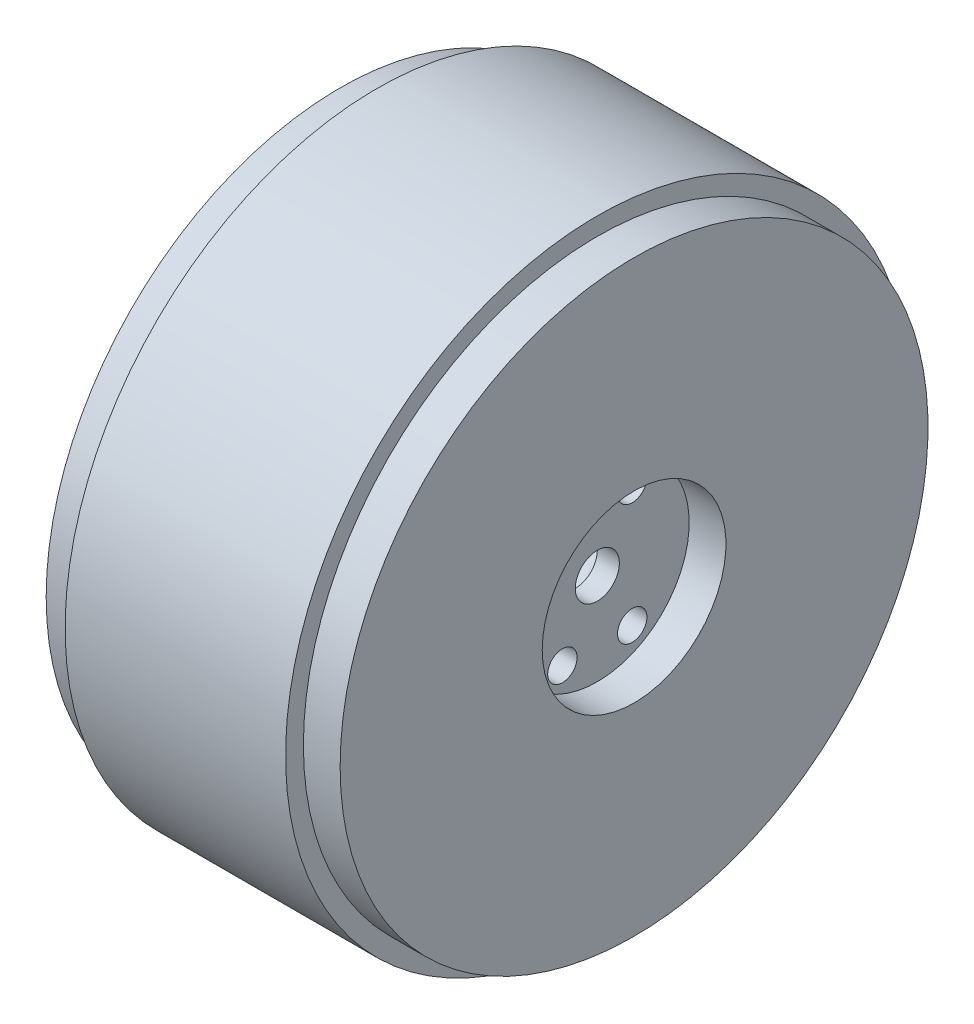
ISO-10303-21;
HEADER;
FILE_DESCRIPTION(('STEP AP214'),'2;1');
FILE_NAME('part.step','',(''),(''),'','','');
FILE_SCHEMA(('AUTOMOTIVE_DESIGN { 1 0 10303 214 1 1 1 1 }'));
ENDSEC;
DATA;
#1=APPLICATION_CONTEXT('core data for automotive mechanical design processes');
#2=APPLICATION_PROTOCOL_DEFINITION('international standard','automotive_design',2000,#1);
#3=PRODUCT_CONTEXT('',#1,'mechanical');
#4=PRODUCT('Part','Part','',(#3));
#5=PRODUCT_RELATED_PRODUCT_CATEGORY('part','',(#4));
#6=PRODUCT_DEFINITION_FORMATION('','',#4);
#7=PRODUCT_DEFINITION_CONTEXT('part definition',#1,'design');
#8=PRODUCT_DEFINITION('design','',#6,#7);
#9=PRODUCT_DEFINITION_SHAPE('','',#8);
#10=(LENGTH_UNIT() NAMED_UNIT(*) SI_UNIT(.MILLI.,.METRE.));
#11=(NAMED_UNIT(*) PLANE_ANGLE_UNIT() SI_UNIT($,.RADIAN.));
#12=(NAMED_UNIT(*) SI_UNIT($,.STERADIAN.) SOLID_ANGLE_UNIT());
#13=UNCERTAINTY_MEASURE_WITH_UNIT(LENGTH_MEASURE(1.E-05),#10,'distance_accuracy_value','');
#14=(GEOMETRIC_REPRESENTATION_CONTEXT(3) GLOBAL_UNCERTAINTY_ASSIGNED_CONTEXT((#13)) GLOBAL_UNIT_ASSIGNED_CONTEXT((#10,
#11,#12)) REPRESENTATION_CONTEXT('',''));
#15=CARTESIAN_POINT('',(0.,0.,0.));
#16=DIRECTION('',(0.,0.,1.));
#17=DIRECTION('',(1.,0.,0.));
#18=AXIS2_PLACEMENT_3D('',#15,#16,#17);
#19=CARTESIAN_POINT('',(-49.6444990272902,0.,0.));
#20=DIRECTION('',(-1.,0.,0.));
#21=DIRECTION('',(0.,0.,1.));
#22=AXIS2_PLACEMENT_3D('',#19,#20,#21);
#23=CYLINDRICAL_SURFACE('',#22,34.);
#24=CARTESIAN_POINT('',(0.,0.,0.));
#25=DIRECTION('',(-1.,0.,0.));
#26=DIRECTION('',(0.,0.,1.));
#27=AXIS2_PLACEMENT_3D('',#24,#25,#26);
#28=CIRCLE('',#27,34.);
#29=CARTESIAN_POINT('',(0.,0.,34.));
#30=VERTEX_POINT('',#29);
#31=EDGE_CURVE('E52',#30,#30,#28,.T.);
#32=ORIENTED_EDGE('',*,*,#31,.F.);
#33=EDGE_LOOP('',(#32));
#34=FACE_BOUND('',#33,.T.);
#35=CARTESIAN_POINT('',(-32.,0.,0.));
#36=DIRECTION('',(-1.,0.,0.));
#37=DIRECTION('',(0.,0.,1.));
#38=AXIS2_PLACEMENT_3D('',#35,#36,#37);
#39=CIRCLE('',#38,34.);
#40=CARTESIAN_POINT('',(-32.,0.,34.));
#41=VERTEX_POINT('',#40);
#42=EDGE_CURVE('E10',#41,#41,#39,.T.);
#43=ORIENTED_EDGE('',*,*,#42,.T.);
#44=EDGE_LOOP('',(#43));
#45=FACE_BOUND('',#44,.T.);
#46=ADVANCED_FACE('F33',(#34,#45),#23,.F.);
#47=CARTESIAN_POINT('',(-32.,34.,0.));
#48=DIRECTION('',(1.,0.,0.));
#49=DIRECTION('',(0.,0.,-1.));
#50=AXIS2_PLACEMENT_3D('',#47,#48,#49);
#51=PLANE('',#50);
#52=ORIENTED_EDGE('',*,*,#42,.F.);
#53=EDGE_LOOP('',(#52));
#54=FACE_BOUND('',#53,.T.);
#55=CARTESIAN_POINT('',(-32.,0.,0.));
#56=DIRECTION('',(-1.,0.,0.));
#57=DIRECTION('',(0.,0.,1.));
#58=AXIS2_PLACEMENT_3D('',#55,#56,#57);
#59=CIRCLE('',#58,40.);
#60=CARTESIAN_POINT('',(-32.,0.,40.));
#61=VERTEX_POINT('',#60);
#62=EDGE_CURVE('E39',#61,#61,#59,.T.);
#63=ORIENTED_EDGE('',*,*,#62,.T.);
#64=EDGE_LOOP('',(#63));
#65=FACE_BOUND('',#64,.T.);
#66=ADVANCED_FACE('F115',(#54,#65),#51,.F.);
#67=CARTESIAN_POINT('',(-49.6444990272902,0.,0.));
#68=DIRECTION('',(-1.,0.,0.));
#69=DIRECTION('',(0.,0.,1.));
#70=AXIS2_PLACEMENT_3D('',#67,#68,#69);
#71=CYLINDRICAL_SURFACE('',#70,40.);
#72=ORIENTED_EDGE('',*,*,#62,.F.);
#73=EDGE_LOOP('',(#72));
#74=FACE_BOUND('',#73,.T.);
#75=CARTESIAN_POINT('',(-27.,0.,0.));
#76=DIRECTION('',(-1.,0.,0.));
#77=DIRECTION('',(0.,0.,1.));
#78=AXIS2_PLACEMENT_3D('',#75,#76,#77);
#79=CIRCLE('',#78,40.);
#80=CARTESIAN_POINT('',(-27.,0.,40.));
#81=VERTEX_POINT('',#80);
#82=EDGE_CURVE('E91',#81,#81,#79,.T.);
#83=ORIENTED_EDGE('',*,*,#82,.T.);
#84=EDGE_LOOP('',(#83));
#85=FACE_BOUND('',#84,.T.);
#86=ADVANCED_FACE('F120',(#74,#85),#71,.T.);
#87=CARTESIAN_POINT('',(-49.6444990272902,0.,0.));
#88=DIRECTION('',(-1.,0.,0.));
#89=DIRECTION('',(0.,0.,1.));
#90=AXIS2_PLACEMENT_3D('',#87,#88,#89);
#91=CYLINDRICAL_SURFACE('',#90,40.);
#92=CARTESIAN_POINT('',(3.,0.,0.));
#93=DIRECTION('',(-1.,0.,0.));
#94=DIRECTION('',(0.,0.,1.));
#95=AXIS2_PLACEMENT_3D('',#92,#93,#94);
#96=CIRCLE('',#95,40.);
#97=CARTESIAN_POINT('',(3.,0.,40.));
#98=VERTEX_POINT('',#97);
#99=EDGE_CURVE('E43',#98,#98,#96,.T.);
#100=ORIENTED_EDGE('',*,*,#99,.F.);
#101=EDGE_LOOP('',(#100));
#102=FACE_BOUND('',#101,.T.);
#103=CARTESIAN_POINT('',(8.,0.,0.));
#104=DIRECTION('',(-1.,0.,0.));
#105=DIRECTION('',(0.,0.,1.));
#106=AXIS2_PLACEMENT_3D('',#103,#104,#105);
#107=CIRCLE('',#106,40.);
#108=CARTESIAN_POINT('',(8.,0.,40.));
#109=VERTEX_POINT('',#108);
#110=EDGE_CURVE('E47',#109,#109,#107,.T.);
#111=ORIENTED_EDGE('',*,*,#110,.T.);
#112=EDGE_LOOP('',(#111));
#113=FACE_BOUND('',#112,.T.);
#114=ADVANCED_FACE('F137',(#102,#113),#91,.T.);
#115=CARTESIAN_POINT('',(8.,40.,0.));
#116=DIRECTION('',(-1.,0.,0.));
#117=DIRECTION('',(0.,0.,1.));
#118=AXIS2_PLACEMENT_3D('',#115,#116,#117);
#119=PLANE('',#118);
#120=CARTESIAN_POINT('',(8.,0.,0.));
#121=DIRECTION('',(-1.,0.,0.));
#122=DIRECTION('',(0.,0.,1.));
#123=AXIS2_PLACEMENT_3D('',#120,#121,#122);
#124=CIRCLE('',#123,12.5);
#125=CARTESIAN_POINT('',(8.,0.,12.5));
#126=VERTEX_POINT('',#125);
#127=EDGE_CURVE('E55',#126,#126,#124,.T.);
#128=ORIENTED_EDGE('',*,*,#127,.T.);
#129=EDGE_LOOP('',(#128));
#130=FACE_BOUND('',#129,.T.);
#131=ORIENTED_EDGE('',*,*,#110,.F.);
#132=EDGE_LOOP('',(#131));
#133=FACE_BOUND('',#132,.T.);
#134=ADVANCED_FACE('F127',(#130,#133),#119,.F.);
#135=CARTESIAN_POINT('',(0.,34.,0.));
#136=DIRECTION('',(1.,0.,0.));
#137=DIRECTION('',(0.,0.,-1.));
#138=AXIS2_PLACEMENT_3D('',#135,#136,#137);
#139=PLANE('',#138);
#140=CARTESIAN_POINT('',(0.,0.,0.));
#141=DIRECTION('',(1.,0.,0.));
#142=DIRECTION('',(0.,0.,-1.));
#143=AXIS2_PLACEMENT_3D('',#140,#141,#142);
#144=CIRCLE('',#143,3.);
#145=CARTESIAN_POINT('',(0.,0.,-3.));
#146=VERTEX_POINT('',#145);
#147=EDGE_CURVE('E85',#146,#146,#144,.T.);
#148=ORIENTED_EDGE('',*,*,#147,.T.);
#149=EDGE_LOOP('',(#148));
#150=FACE_BOUND('',#149,.T.);
#151=CARTESIAN_POINT('',(0.,8.22724133595216,4.75000000000001));
#152=DIRECTION('',(1.,0.,0.));
#153=DIRECTION('',(0.,0.,-1.));
#154=AXIS2_PLACEMENT_3D('',#151,#152,#153);
#155=CIRCLE('',#154,2.);
#156=CARTESIAN_POINT('',(0.,8.22724133595216,2.75000000000001));
#157=VERTEX_POINT('',#156);
#158=EDGE_CURVE('E61',#157,#157,#155,.T.);
#159=ORIENTED_EDGE('',*,*,#158,.T.);
#160=EDGE_LOOP('',(#159));
#161=FACE_BOUND('',#160,.T.);
#162=CARTESIAN_POINT('',(0.,-8.22724133595216,-4.75000000000001));
#163=DIRECTION('',(1.,0.,0.));
#164=DIRECTION('',(0.,0.,-1.));
#165=AXIS2_PLACEMENT_3D('',#162,#163,#164);
#166=CIRCLE('',#165,2.);
#167=CARTESIAN_POINT('',(0.,-8.22724133595216,-6.75000000000001));
#168=VERTEX_POINT('',#167);
#169=EDGE_CURVE('E64',#168,#168,#166,.T.);
#170=ORIENTED_EDGE('',*,*,#169,.T.);
#171=EDGE_LOOP('',(#170));
#172=FACE_BOUND('',#171,.T.);
#173=CARTESIAN_POINT('',(0.,-8.22724133595216,4.75000000000001));
#174=DIRECTION('',(1.,0.,0.));
#175=DIRECTION('',(0.,0.,-1.));
#176=AXIS2_PLACEMENT_3D('',#173,#174,#175);
#177=CIRCLE('',#176,2.);
#178=CARTESIAN_POINT('',(0.,-8.22724133595216,2.75000000000001));
#179=VERTEX_POINT('',#178);
#180=EDGE_CURVE('E67',#179,#179,#177,.T.);
#181=ORIENTED_EDGE('',*,*,#180,.T.);
#182=EDGE_LOOP('',(#181));
#183=FACE_BOUND('',#182,.T.);
#184=CARTESIAN_POINT('',(0.,8.22724133595216,-4.75000000000001));
#185=DIRECTION('',(1.,0.,0.));
#186=DIRECTION('',(0.,0.,-1.));
#187=AXIS2_PLACEMENT_3D('',#184,#185,#186);
#188=CIRCLE('',#187,2.);
#189=CARTESIAN_POINT('',(0.,8.22724133595216,-6.75000000000001));
#190=VERTEX_POINT('',#189);
#191=EDGE_CURVE('E70',#190,#190,#188,.T.);
#192=ORIENTED_EDGE('',*,*,#191,.T.);
#193=EDGE_LOOP('',(#192));
#194=FACE_BOUND('',#193,.T.);
#195=ORIENTED_EDGE('',*,*,#31,.T.);
#196=EDGE_LOOP('',(#195));
#197=FACE_BOUND('',#196,.T.);
#198=ADVANCED_FACE('F124',(#150,#161,#172,#183,#194,#197),#139,.F.);
#199=CARTESIAN_POINT('',(0.,0.,0.));
#200=DIRECTION('',(-1.,0.,0.));
#201=DIRECTION('',(0.,0.,1.));
#202=AXIS2_PLACEMENT_3D('',#199,#200,#201);
#203=CYLINDRICAL_SURFACE('',#202,12.5);
#204=CARTESIAN_POINT('',(3.,0.,0.));
#205=DIRECTION('',(-1.,0.,0.));
#206=DIRECTION('',(0.,0.,1.));
#207=AXIS2_PLACEMENT_3D('',#204,#205,#206);
#208=CIRCLE('',#207,12.5);
#209=CARTESIAN_POINT('',(3.,0.,12.5));
#210=VERTEX_POINT('',#209);
#211=EDGE_CURVE('E58',#210,#210,#208,.T.);
#212=ORIENTED_EDGE('',*,*,#211,.T.);
#213=EDGE_LOOP('',(#212));
#214=FACE_BOUND('',#213,.T.);
#215=ORIENTED_EDGE('',*,*,#127,.F.);
#216=EDGE_LOOP('',(#215));
#217=FACE_BOUND('',#216,.T.);
#218=ADVANCED_FACE('F126',(#214,#217),#203,.F.);
#219=CARTESIAN_POINT('',(3.,12.5,0.));
#220=DIRECTION('',(1.,0.,0.));
#221=DIRECTION('',(0.,0.,-1.));
#222=AXIS2_PLACEMENT_3D('',#219,#220,#221);
#223=PLANE('',#222);
#224=CARTESIAN_POINT('',(3.,0.,0.));
#225=DIRECTION('',(1.,0.,0.));
#226=DIRECTION('',(0.,0.,-1.));
#227=AXIS2_PLACEMENT_3D('',#224,#225,#226);
#228=CIRCLE('',#227,3.);
#229=CARTESIAN_POINT('',(3.,0.,-3.));
#230=VERTEX_POINT('',#229);
#231=EDGE_CURVE('E88',#230,#230,#228,.T.);
#232=ORIENTED_EDGE('',*,*,#231,.F.);
#233=EDGE_LOOP('',(#232));
#234=FACE_BOUND('',#233,.T.);
#235=CARTESIAN_POINT('',(3.,8.22724133595216,4.75000000000001));
#236=DIRECTION('',(1.,0.,0.));
#237=DIRECTION('',(0.,0.,1.));
#238=AXIS2_PLACEMENT_3D('',#235,#236,#237);
#239=CIRCLE('',#238,2.);
#240=CARTESIAN_POINT('',(3.,8.22724133595216,6.75000000000001));
#241=VERTEX_POINT('',#240);
#242=EDGE_CURVE('E76',#241,#241,#239,.T.);
#243=ORIENTED_EDGE('',*,*,#242,.F.);
#244=EDGE_LOOP('',(#243));
#245=FACE_BOUND('',#244,.T.);
#246=CARTESIAN_POINT('',(3.,-8.22724133595216,-4.75000000000001));
#247=DIRECTION('',(1.,0.,0.));
#248=DIRECTION('',(0.,0.,1.));
#249=AXIS2_PLACEMENT_3D('',#246,#247,#248);
#250=CIRCLE('',#249,2.);
#251=CARTESIAN_POINT('',(3.,-8.22724133595216,-2.75000000000001));
#252=VERTEX_POINT('',#251);
#253=EDGE_CURVE('E77',#252,#252,#250,.T.);
#254=ORIENTED_EDGE('',*,*,#253,.F.);
#255=EDGE_LOOP('',(#254));
#256=FACE_BOUND('',#255,.T.);
#257=CARTESIAN_POINT('',(3.,-8.22724133595216,4.75000000000001));
#258=DIRECTION('',(1.,0.,0.));
#259=DIRECTION('',(0.,0.,-1.));
#260=AXIS2_PLACEMENT_3D('',#257,#258,#259);
#261=CIRCLE('',#260,2.);
#262=CARTESIAN_POINT('',(3.,-8.22724133595216,2.75000000000001));
#263=VERTEX_POINT('',#262);
#264=EDGE_CURVE('E80',#263,#263,#261,.T.);
#265=ORIENTED_EDGE('',*,*,#264,.F.);
#266=EDGE_LOOP('',(#265));
#267=FACE_BOUND('',#266,.T.);
#268=CARTESIAN_POINT('',(3.,8.22724133595216,-4.75000000000001));
#269=DIRECTION('',(1.,0.,0.));
#270=DIRECTION('',(0.,0.,-1.));
#271=AXIS2_PLACEMENT_3D('',#268,#269,#270);
#272=CIRCLE('',#271,2.);
#273=CARTESIAN_POINT('',(3.,8.22724133595216,-6.75000000000001));
#274=VERTEX_POINT('',#273);
#275=EDGE_CURVE('E73',#274,#274,#272,.T.);
#276=ORIENTED_EDGE('',*,*,#275,.F.);
#277=EDGE_LOOP('',(#276));
#278=FACE_BOUND('',#277,.T.);
#279=ORIENTED_EDGE('',*,*,#211,.F.);
#280=EDGE_LOOP('',(#279));
#281=FACE_BOUND('',#280,.T.);
#282=ADVANCED_FACE('F134',(#234,#245,#256,#267,#278,#281),#223,.T.);
#283=CARTESIAN_POINT('',(-32.,8.22724133595216,-4.75000000000001));
#284=DIRECTION('',(1.,0.,0.));
#285=DIRECTION('',(0.,0.,-1.));
#286=AXIS2_PLACEMENT_3D('',#283,#284,#285);
#287=CYLINDRICAL_SURFACE('',#286,2.);
#288=ORIENTED_EDGE('',*,*,#275,.T.);
#289=EDGE_LOOP('',(#288));
#290=FACE_BOUND('',#289,.T.);
#291=ORIENTED_EDGE('',*,*,#191,.F.);
#292=EDGE_LOOP('',(#291));
#293=FACE_BOUND('',#292,.T.);
#294=ADVANCED_FACE('F168',(#290,#293),#287,.F.);
#295=CARTESIAN_POINT('',(-32.,-8.22724133595216,4.75000000000001));
#296=DIRECTION('',(1.,0.,0.));
#297=DIRECTION('',(0.,0.,-1.));
#298=AXIS2_PLACEMENT_3D('',#295,#296,#297);
#299=CYLINDRICAL_SURFACE('',#298,2.);
#300=ORIENTED_EDGE('',*,*,#264,.T.);
#301=EDGE_LOOP('',(#300));
#302=FACE_BOUND('',#301,.T.);
#303=ORIENTED_EDGE('',*,*,#180,.F.);
#304=EDGE_LOOP('',(#303));
#305=FACE_BOUND('',#304,.T.);
#306=ADVANCED_FACE('F164',(#302,#305),#299,.F.);
#307=CARTESIAN_POINT('',(-32.,-8.22724133595216,-4.75000000000001));
#308=DIRECTION('',(1.,0.,0.));
#309=DIRECTION('',(0.,0.,-1.));
#310=AXIS2_PLACEMENT_3D('',#307,#308,#309);
#311=CYLINDRICAL_SURFACE('',#310,2.);
#312=ORIENTED_EDGE('',*,*,#253,.T.);
#313=EDGE_LOOP('',(#312));
#314=FACE_BOUND('',#313,.T.);
#315=ORIENTED_EDGE('',*,*,#169,.F.);
#316=EDGE_LOOP('',(#315));
#317=FACE_BOUND('',#316,.T.);
#318=ADVANCED_FACE('F167',(#314,#317),#311,.F.);
#319=CARTESIAN_POINT('',(-32.,8.22724133595216,4.75000000000001));
#320=DIRECTION('',(1.,0.,0.));
#321=DIRECTION('',(0.,0.,-1.));
#322=AXIS2_PLACEMENT_3D('',#319,#320,#321);
#323=CYLINDRICAL_SURFACE('',#322,2.);
#324=ORIENTED_EDGE('',*,*,#242,.T.);
#325=EDGE_LOOP('',(#324));
#326=FACE_BOUND('',#325,.T.);
#327=ORIENTED_EDGE('',*,*,#158,.F.);
#328=EDGE_LOOP('',(#327));
#329=FACE_BOUND('',#328,.T.);
#330=ADVANCED_FACE('F159',(#326,#329),#323,.F.);
#331=CARTESIAN_POINT('',(-32.,0.,0.));
#332=DIRECTION('',(1.,0.,0.));
#333=DIRECTION('',(0.,0.,-1.));
#334=AXIS2_PLACEMENT_3D('',#331,#332,#333);
#335=CYLINDRICAL_SURFACE('',#334,3.);
#336=ORIENTED_EDGE('',*,*,#231,.T.);
#337=EDGE_LOOP('',(#336));
#338=FACE_BOUND('',#337,.T.);
#339=ORIENTED_EDGE('',*,*,#147,.F.);
#340=EDGE_LOOP('',(#339));
#341=FACE_BOUND('',#340,.T.);
#342=ADVANCED_FACE('F154',(#338,#341),#335,.F.);
#343=CARTESIAN_POINT('',(-27.,39.,0.));
#344=DIRECTION('',(-1.,0.,0.));
#345=DIRECTION('',(0.,0.,1.));
#346=AXIS2_PLACEMENT_3D('',#343,#344,#345);
#347=PLANE('',#346);
#348=CARTESIAN_POINT('',(-27.,0.,0.));
#349=DIRECTION('',(1.,0.,0.));
#350=DIRECTION('',(0.,0.,-1.));
#351=AXIS2_PLACEMENT_3D('',#348,#349,#350);
#352=CIRCLE('',#351,42.4219137981652);
#353=CARTESIAN_POINT('',(-27.,0.,-42.4219137981652));
#354=VERTEX_POINT('',#353);
#355=EDGE_CURVE('E94',#354,#354,#352,.T.);
#356=ORIENTED_EDGE('',*,*,#355,.F.);
#357=EDGE_LOOP('',(#356));
#358=FACE_BOUND('',#357,.T.);
#359=ORIENTED_EDGE('',*,*,#82,.F.);
#360=EDGE_LOOP('',(#359));
#361=FACE_BOUND('',#360,.T.);
#362=ADVANCED_FACE('F110',(#358,#361),#347,.T.);
#363=CARTESIAN_POINT('',(3.,42.4219137981652,0.));
#364=DIRECTION('',(1.,0.,0.));
#365=DIRECTION('',(0.,0.,-1.));
#366=AXIS2_PLACEMENT_3D('',#363,#364,#365);
#367=PLANE('',#366);
#368=ORIENTED_EDGE('',*,*,#99,.T.);
#369=EDGE_LOOP('',(#368));
#370=FACE_BOUND('',#369,.T.);
#371=CARTESIAN_POINT('',(3.,0.,0.));
#372=DIRECTION('',(1.,0.,0.));
#373=DIRECTION('',(0.,0.,-1.));
#374=AXIS2_PLACEMENT_3D('',#371,#372,#373);
#375=CIRCLE('',#374,42.4219137981652);
#376=CARTESIAN_POINT('',(3.,0.,-42.4219137981652));
#377=VERTEX_POINT('',#376);
#378=EDGE_CURVE('E97',#377,#377,#375,.T.);
#379=ORIENTED_EDGE('',*,*,#378,.T.);
#380=EDGE_LOOP('',(#379));
#381=FACE_BOUND('',#380,.T.);
#382=ADVANCED_FACE('F101',(#370,#381),#367,.T.);
#383=CARTESIAN_POINT('',(0.,0.,0.));
#384=DIRECTION('',(1.,0.,0.));
#385=DIRECTION('',(0.,0.,-1.));
#386=AXIS2_PLACEMENT_3D('',#383,#384,#385);
#387=CYLINDRICAL_SURFACE('',#386,42.4219137981652);
#388=ORIENTED_EDGE('',*,*,#355,.T.);
#389=EDGE_LOOP('',(#388));
#390=FACE_BOUND('',#389,.T.);
#391=ORIENTED_EDGE('',*,*,#378,.F.);
#392=EDGE_LOOP('',(#391));
#393=FACE_BOUND('',#392,.T.);
#394=ADVANCED_FACE('F103',(#390,#393),#387,.T.);
#395=CLOSED_SHELL('',(#46,#66,#86,#114,#134,#198,#218,#282,#294,#306,#318,#330,#342,#362,#382,#394));
#396=MANIFOLD_SOLID_BREP('B2',#395);
#397=ADVANCED_BREP_SHAPE_REPRESENTATION('',(#18,#396),#14);
#398=SHAPE_DEFINITION_REPRESENTATION(#9,#397);
ENDSEC;
END-ISO-10303-21;
